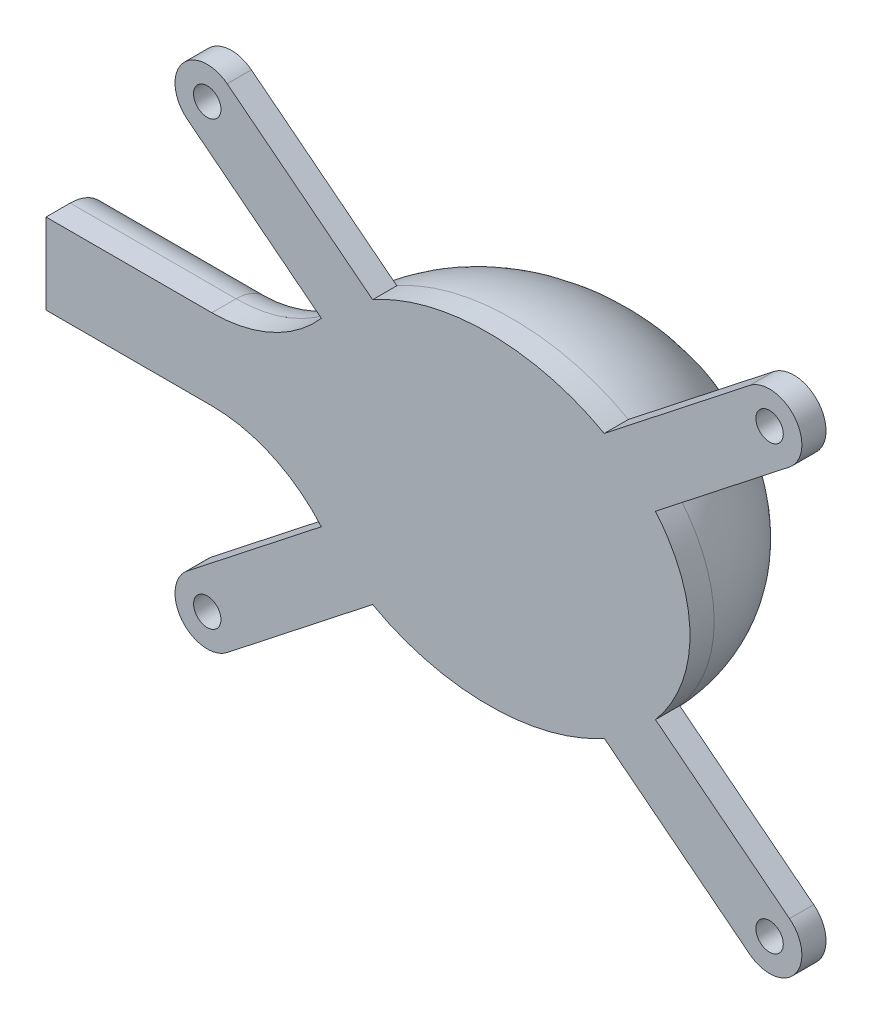
ISO-10303-21;
HEADER;
FILE_DESCRIPTION(('STEP AP214'),'2;1');
FILE_NAME('part.step','',(''),(''),'','','');
FILE_SCHEMA(('AUTOMOTIVE_DESIGN { 1 0 10303 214 1 1 1 1 }'));
ENDSEC;
DATA;
#1=APPLICATION_CONTEXT('core data for automotive mechanical design processes');
#2=APPLICATION_PROTOCOL_DEFINITION('international standard','automotive_design',2000,#1);
#3=PRODUCT_CONTEXT('',#1,'mechanical');
#4=PRODUCT('Part','Part','',(#3));
#5=PRODUCT_RELATED_PRODUCT_CATEGORY('part','',(#4));
#6=PRODUCT_DEFINITION_FORMATION('','',#4);
#7=PRODUCT_DEFINITION_CONTEXT('part definition',#1,'design');
#8=PRODUCT_DEFINITION('design','',#6,#7);
#9=PRODUCT_DEFINITION_SHAPE('','',#8);
#10=(LENGTH_UNIT() NAMED_UNIT(*) SI_UNIT(.MILLI.,.METRE.));
#11=(NAMED_UNIT(*) PLANE_ANGLE_UNIT() SI_UNIT($,.RADIAN.));
#12=(NAMED_UNIT(*) SI_UNIT($,.STERADIAN.) SOLID_ANGLE_UNIT());
#13=UNCERTAINTY_MEASURE_WITH_UNIT(LENGTH_MEASURE(1.E-05),#10,'distance_accuracy_value','');
#14=(GEOMETRIC_REPRESENTATION_CONTEXT(3) GLOBAL_UNCERTAINTY_ASSIGNED_CONTEXT((#13)) GLOBAL_UNIT_ASSIGNED_CONTEXT((#10,
#11,#12)) REPRESENTATION_CONTEXT('',''));
#15=CARTESIAN_POINT('',(0.,0.,0.));
#16=DIRECTION('',(0.,0.,1.));
#17=DIRECTION('',(1.,0.,0.));
#18=AXIS2_PLACEMENT_3D('',#15,#16,#17);
#19=CARTESIAN_POINT('',(0.,0.,0.));
#20=DIRECTION('',(0.,0.,-1.));
#21=DIRECTION('',(1.,0.,0.));
#22=AXIS2_PLACEMENT_3D('',#19,#20,#21);
#23=PLANE('',#22);
#24=DIRECTION('',(0.786318338822422,0.617821551931904,0.));
#25=VECTOR('',#24,1.);
#26=CARTESIAN_POINT('',(-37.3413406568325,-24.2526265690071,0.));
#27=LINE('',#26,#25);
#28=CARTESIAN_POINT('',(-20.7197162752524,-11.1927788406226,0.));
#29=VERTEX_POINT('',#28);
#30=CARTESIAN_POINT('',(-20.7189330004743,-11.1921634104398,0.));
#31=VERTEX_POINT('',#30);
#32=EDGE_CURVE('E529',#29,#31,#27,.T.);
#33=ORIENTED_EDGE('',*,*,#32,.T.);
#34=CARTESIAN_POINT('',(-34.3047710340387,-23.,1.60678761962352E-13));
#35=DIRECTION('',(0.,0.,-1.));
#36=DIRECTION('',(0.,1.,0.));
#37=AXIS2_PLACEMENT_3D('',#34,#35,#36);
#38=CIRCLE('',#37,18.);
#39=CARTESIAN_POINT('',(-34.3047710340404,-5.00000002413178,0.));
#40=VERTEX_POINT('',#39);
#41=EDGE_CURVE('E633',#31,#40,#38,.F.);
#42=ORIENTED_EDGE('',*,*,#41,.T.);
#43=CARTESIAN_POINT('',(-34.3060891721499,-23.,1.60608141586784E-13));
#44=DIRECTION('',(0.,0.,-1.));
#45=DIRECTION('',(0.,1.,0.));
#46=AXIS2_PLACEMENT_3D('',#43,#44,#45);
#47=CIRCLE('',#46,18.);
#48=EDGE_CURVE('E635',#40,#29,#47,.T.);
#49=ORIENTED_EDGE('',*,*,#48,.T.);
#50=EDGE_LOOP('',(#33,#42,#49));
#51=FACE_BOUND('',#50,.T.);
#52=ADVANCED_FACE('F195',(#51),#23,.F.);
#53=CARTESIAN_POINT('',(-34.3060891721499,23.,-1.60608141586784E-13));
#54=DIRECTION('',(0.,0.,-1.));
#55=DIRECTION('',(0.,1.,0.));
#56=AXIS2_PLACEMENT_3D('',#53,#54,#55);
#57=CIRCLE('',#56,18.);
#58=CARTESIAN_POINT('',(-20.7197162752524,11.1927788406226,0.));
#59=VERTEX_POINT('',#58);
#60=CARTESIAN_POINT('',(-34.3047710340404,5.00000002413178,0.));
#61=VERTEX_POINT('',#60);
#62=EDGE_CURVE('E660',#59,#61,#57,.T.);
#63=ORIENTED_EDGE('',*,*,#62,.T.);
#64=CARTESIAN_POINT('',(-34.3047710340387,23.,-1.60678761962352E-13));
#65=DIRECTION('',(0.,0.,-1.));
#66=DIRECTION('',(0.,1.,0.));
#67=AXIS2_PLACEMENT_3D('',#64,#65,#66);
#68=CIRCLE('',#67,18.);
#69=CARTESIAN_POINT('',(-20.7189330004743,11.1921634104399,0.));
#70=VERTEX_POINT('',#69);
#71=EDGE_CURVE('E204',#61,#70,#68,.F.);
#72=ORIENTED_EDGE('',*,*,#71,.T.);
#73=DIRECTION('',(0.786318338822422,-0.617821551931904,0.));
#74=VECTOR('',#73,1.);
#75=CARTESIAN_POINT('',(-37.3413406568325,24.2526265690071,0.));
#76=LINE('',#75,#74);
#77=EDGE_CURVE('E534',#59,#70,#76,.T.);
#78=ORIENTED_EDGE('',*,*,#77,.F.);
#79=EDGE_LOOP('',(#63,#72,#78));
#80=FACE_BOUND('',#79,.T.);
#81=ADVANCED_FACE('F624',(#80),#23,.F.);
#82=CARTESIAN_POINT('',(-32.3987682413773,30.5431732795864,3.));
#83=DIRECTION('',(0.617821551931904,0.786318338822422,0.));
#84=DIRECTION('',(-0.786318338822422,0.617821551931904,0.));
#85=AXIS2_PLACEMENT_3D('',#82,#83,#84);
#86=PLANE('',#85);
#87=DIRECTION('',(0.786318338822422,-0.617821551931904,0.));
#88=VECTOR('',#87,1.);
#89=CARTESIAN_POINT('',(-32.3987682413773,30.5431732795864,3.));
#90=LINE('',#89,#88);
#91=CARTESIAN_POINT('',(-32.3987682413773,30.5431732795864,3.));
#92=VERTEX_POINT('',#91);
#93=CARTESIAN_POINT('',(-14.3612173061904,16.370811830511,3.));
#94=VERTEX_POINT('',#93);
#95=EDGE_CURVE('E457',#92,#94,#90,.T.);
#96=ORIENTED_EDGE('',*,*,#95,.T.);
#97=DIRECTION('',(0.,0.,-1.));
#98=VECTOR('',#97,1.);
#99=CARTESIAN_POINT('',(-14.3612173061904,16.3708118305111,3.));
#100=LINE('',#99,#98);
#101=CARTESIAN_POINT('',(-14.3612173061904,16.3708118305111,-1.14316768015883E-13));
#102=VERTEX_POINT('',#101);
#103=EDGE_CURVE('E421',#94,#102,#100,.T.);
#104=ORIENTED_EDGE('',*,*,#103,.T.);
#105=DIRECTION('',(0.786318338822422,-0.617821551931904,0.));
#106=VECTOR('',#105,1.);
#107=CARTESIAN_POINT('',(-32.3987682413773,30.5431732795864,0.));
#108=LINE('',#107,#106);
#109=CARTESIAN_POINT('',(-32.3987682413773,30.5431732795864,0.));
#110=VERTEX_POINT('',#109);
#111=EDGE_CURVE('E453',#110,#102,#108,.T.);
#112=ORIENTED_EDGE('',*,*,#111,.F.);
#113=DIRECTION('',(0.,0.,-1.));
#114=VECTOR('',#113,1.);
#115=CARTESIAN_POINT('',(-32.3987682413773,30.5431732795864,3.));
#116=LINE('',#115,#114);
#117=EDGE_CURVE('E541',#92,#110,#116,.T.);
#118=ORIENTED_EDGE('',*,*,#117,.F.);
#119=EDGE_LOOP('',(#96,#104,#112,#118));
#120=FACE_BOUND('',#119,.T.);
#121=ADVANCED_FACE('F629',(#120),#86,.T.);
#122=CARTESIAN_POINT('',(-37.3413406568325,24.2526265690071,3.));
#123=DIRECTION('',(0.617821551931904,0.786318338822422,0.));
#124=DIRECTION('',(-0.786318338822422,0.617821551931904,0.));
#125=AXIS2_PLACEMENT_3D('',#122,#123,#124);
#126=PLANE('',#125);
#127=DIRECTION('',(0.,0.,-1.));
#128=VECTOR('',#127,1.);
#129=CARTESIAN_POINT('',(-20.7189330004743,11.1921634104399,3.));
#130=LINE('',#129,#128);
#131=CARTESIAN_POINT('',(-20.7189330004743,11.1921634104399,3.));
#132=VERTEX_POINT('',#131);
#133=EDGE_CURVE('E418',#132,#70,#130,.T.);
#134=ORIENTED_EDGE('',*,*,#133,.F.);
#135=DIRECTION('',(0.786318338822422,-0.617821551931904,0.));
#136=VECTOR('',#135,1.);
#137=CARTESIAN_POINT('',(-37.3413406568325,24.2526265690071,3.));
#138=LINE('',#137,#136);
#139=CARTESIAN_POINT('',(-37.3413406568325,24.2526265690071,3.));
#140=VERTEX_POINT('',#139);
#141=EDGE_CURVE('E492',#140,#132,#138,.T.);
#142=ORIENTED_EDGE('',*,*,#141,.F.);
#143=DIRECTION('',(0.,0.,-1.));
#144=VECTOR('',#143,1.);
#145=CARTESIAN_POINT('',(-37.3413406568325,24.2526265690071,3.));
#146=LINE('',#145,#144);
#147=CARTESIAN_POINT('',(-37.3413406568325,24.2526265690071,0.));
#148=VERTEX_POINT('',#147);
#149=EDGE_CURVE('E545',#140,#148,#146,.T.);
#150=ORIENTED_EDGE('',*,*,#149,.T.);
#151=EDGE_CURVE('E535',#148,#59,#76,.T.);
#152=ORIENTED_EDGE('',*,*,#151,.T.);
#153=ORIENTED_EDGE('',*,*,#77,.T.);
#154=EDGE_LOOP('',(#134,#142,#150,#152,#153));
#155=FACE_BOUND('',#154,.T.);
#156=ADVANCED_FACE('F756',(#155),#126,.F.);
#157=CARTESIAN_POINT('',(6.47436138718722,0.,3.));
#158=DIRECTION('',(-0.617821551931904,0.786318338822422,0.));
#159=DIRECTION('',(-0.786318338822422,-0.617821551931904,0.));
#160=AXIS2_PLACEMENT_3D('',#157,#158,#159);
#161=PLANE('',#160);
#162=DIRECTION('',(0.,0.,-1.));
#163=VECTOR('',#162,1.);
#164=CARTESIAN_POINT('',(20.7189330004743,11.1921634104399,3.));
#165=LINE('',#164,#163);
#166=CARTESIAN_POINT('',(20.7189330004743,11.1921634104399,0.));
#167=VERTEX_POINT('',#166);
#168=CARTESIAN_POINT('',(20.7189330004743,11.1921634104399,3.));
#169=VERTEX_POINT('',#168);
#170=EDGE_CURVE('E411',#167,#169,#165,.F.);
#171=ORIENTED_EDGE('',*,*,#170,.F.);
#172=DIRECTION('',(0.786318338822422,0.617821551931904,0.));
#173=VECTOR('',#172,1.);
#174=CARTESIAN_POINT('',(6.47436138718722,0.,0.));
#175=LINE('',#174,#173);
#176=CARTESIAN_POINT('',(37.3413406568325,24.2526265690071,0.));
#177=VERTEX_POINT('',#176);
#178=EDGE_CURVE('E509',#167,#177,#175,.T.);
#179=ORIENTED_EDGE('',*,*,#178,.T.);
#180=DIRECTION('',(0.,0.,-1.));
#181=VECTOR('',#180,1.);
#182=CARTESIAN_POINT('',(37.3413406568325,24.2526265690071,3.));
#183=LINE('',#182,#181);
#184=CARTESIAN_POINT('',(37.3413406568325,24.2526265690071,3.));
#185=VERTEX_POINT('',#184);
#186=EDGE_CURVE('E564',#185,#177,#183,.T.);
#187=ORIENTED_EDGE('',*,*,#186,.F.);
#188=DIRECTION('',(0.786318338822422,0.617821551931904,0.));
#189=VECTOR('',#188,1.);
#190=CARTESIAN_POINT('',(6.47436138718722,0.,3.));
#191=LINE('',#190,#189);
#192=EDGE_CURVE('E468',#169,#185,#191,.T.);
#193=ORIENTED_EDGE('',*,*,#192,.F.);
#194=EDGE_LOOP('',(#171,#179,#187,#193));
#195=FACE_BOUND('',#194,.T.);
#196=ADVANCED_FACE('F815',(#195),#161,.F.);
#197=CARTESIAN_POINT('',(0.,5.08699823278997,3.));
#198=DIRECTION('',(-0.617821551931904,0.786318338822422,0.));
#199=DIRECTION('',(-0.786318338822422,-0.617821551931904,0.));
#200=AXIS2_PLACEMENT_3D('',#197,#198,#199);
#201=PLANE('',#200);
#202=DIRECTION('',(0.786318338822422,0.617821551931904,0.));
#203=VECTOR('',#202,1.);
#204=CARTESIAN_POINT('',(0.,5.08699823278997,0.));
#205=LINE('',#204,#203);
#206=CARTESIAN_POINT('',(14.3612173061905,16.3708118305111,-1.14316768015884E-13));
#207=VERTEX_POINT('',#206);
#208=CARTESIAN_POINT('',(32.3987682413773,30.5431732795864,0.));
#209=VERTEX_POINT('',#208);
#210=EDGE_CURVE('E502',#207,#209,#205,.T.);
#211=ORIENTED_EDGE('',*,*,#210,.F.);
#212=DIRECTION('',(0.,0.,-1.));
#213=VECTOR('',#212,1.);
#214=CARTESIAN_POINT('',(14.3612173061905,16.3708118305111,3.));
#215=LINE('',#214,#213);
#216=CARTESIAN_POINT('',(14.3612173061905,16.3708118305111,3.));
#217=VERTEX_POINT('',#216);
#218=EDGE_CURVE('E648',#207,#217,#215,.F.);
#219=ORIENTED_EDGE('',*,*,#218,.T.);
#220=DIRECTION('',(0.786318338822422,0.617821551931904,0.));
#221=VECTOR('',#220,1.);
#222=CARTESIAN_POINT('',(0.,5.08699823278997,3.));
#223=LINE('',#222,#221);
#224=CARTESIAN_POINT('',(32.3987682413773,30.5431732795864,3.));
#225=VERTEX_POINT('',#224);
#226=EDGE_CURVE('E460',#217,#225,#223,.T.);
#227=ORIENTED_EDGE('',*,*,#226,.T.);
#228=DIRECTION('',(0.,0.,-1.));
#229=VECTOR('',#228,1.);
#230=CARTESIAN_POINT('',(32.3987682413773,30.5431732795864,3.));
#231=LINE('',#230,#229);
#232=EDGE_CURVE('E498',#225,#209,#231,.T.);
#233=ORIENTED_EDGE('',*,*,#232,.T.);
#234=EDGE_LOOP('',(#211,#219,#227,#233));
#235=FACE_BOUND('',#234,.T.);
#236=ADVANCED_FACE('F605',(#235),#201,.T.);
#237=CARTESIAN_POINT('',(0.,0.,0.));
#238=DIRECTION('',(0.,0.,-1.));
#239=DIRECTION('',(1.,0.,0.));
#240=AXIS2_PLACEMENT_3D('',#237,#238,#239);
#241=ELLIPSE('',#240,25.,20.);
#242=TRIMMED_CURVE('',#241,(PARAMETER_VALUE(6.28318530717959)),
(PARAMETER_VALUE(9.42477796076938)),.T.,.PARAMETER.);
#243=CARTESIAN_POINT('',(25.,0.,0.));
#244=DIRECTION('',(1.,0.,0.));
#245=AXIS1_PLACEMENT('',#243,#244);
#246=SURFACE_OF_REVOLUTION('',#242,#245);
#247=CARTESIAN_POINT('',(25.,0.,0.));
#248=VERTEX_POINT('',#247);
#249=CARTESIAN_POINT('',(20.7189330004743,-11.1921634104398,0.));
#250=VERTEX_POINT('',#249);
#251=EDGE_CURVE('E593',#248,#250,#241,.T.);
#252=ORIENTED_EDGE('',*,*,#251,.T.);
#253=CARTESIAN_POINT('',(0.,0.,0.));
#254=DIRECTION('',(0.,0.,-1.));
#255=DIRECTION('',(1.,0.,0.));
#256=AXIS2_PLACEMENT_3D('',#253,#254,#255);
#257=ELLIPSE('',#256,25.,20.);
#258=CARTESIAN_POINT('',(14.3612173061905,-16.370811830511,0.));
#259=VERTEX_POINT('',#258);
#260=EDGE_CURVE('E575',#250,#259,#257,.T.);
#261=ORIENTED_EDGE('',*,*,#260,.T.);
#262=CARTESIAN_POINT('',(-14.3612173061904,-16.370811830511,0.));
#263=VERTEX_POINT('',#262);
#264=EDGE_CURVE('E592',#259,#263,#241,.T.);
#265=ORIENTED_EDGE('',*,*,#264,.T.);
#266=CARTESIAN_POINT('',(-20.6295359356946,-11.2973553599879,0.));
#267=VERTEX_POINT('',#266);
#268=EDGE_CURVE('E544',#263,#267,#257,.T.);
#269=ORIENTED_EDGE('',*,*,#268,.T.);
#270=CARTESIAN_POINT('',(-20.6295359356946,0.,0.));
#271=DIRECTION('',(1.,0.,0.));
#272=DIRECTION('',(0.,0.,-1.));
#273=AXIS2_PLACEMENT_3D('',#270,#271,#272);
#274=CIRCLE('',#273,11.2973553599879);
#275=CARTESIAN_POINT('',(-20.6295359356946,11.2973553599879,0.));
#276=VERTEX_POINT('',#275);
#277=EDGE_CURVE('E680',#267,#276,#274,.T.);
#278=ORIENTED_EDGE('',*,*,#277,.T.);
#279=CARTESIAN_POINT('',(0.,0.,0.));
#280=DIRECTION('',(0.,0.,1.));
#281=DIRECTION('',(1.,0.,0.));
#282=AXIS2_PLACEMENT_3D('',#279,#280,#281);
#283=ELLIPSE('',#282,25.,20.);
#284=EDGE_CURVE('E574',#276,#102,#283,.F.);
#285=ORIENTED_EDGE('',*,*,#284,.T.);
#286=CARTESIAN_POINT('',(0.,0.,0.));
#287=DIRECTION('',(0.,0.,1.));
#288=DIRECTION('',(1.,0.,0.));
#289=AXIS2_PLACEMENT_3D('',#286,#287,#288);
#290=ELLIPSE('',#289,25.,20.);
#291=EDGE_CURVE('E588',#207,#102,#290,.T.);
#292=ORIENTED_EDGE('',*,*,#291,.F.);
#293=EDGE_CURVE('E579',#207,#167,#283,.F.);
#294=ORIENTED_EDGE('',*,*,#293,.T.);
#295=EDGE_CURVE('E589',#248,#167,#290,.T.);
#296=ORIENTED_EDGE('',*,*,#295,.F.);
#297=EDGE_LOOP('',(#252,#261,#265,#269,#278,#285,#292,#294,#296));
#298=FACE_BOUND('',#297,.T.);
#299=ADVANCED_FACE('F601',(#298),#246,.F.);
#300=CARTESIAN_POINT('',(-54.865727699422,0.,0.));
#301=DIRECTION('',(-1.,0.,0.));
#302=DIRECTION('',(0.,0.,1.));
#303=AXIS2_PLACEMENT_3D('',#300,#301,#302);
#304=PLANE('',#303);
#305=CARTESIAN_POINT('',(-54.865727699422,0.,0.));
#306=DIRECTION('',(1.,0.,0.));
#307=DIRECTION('',(0.,0.,-1.));
#308=AXIS2_PLACEMENT_3D('',#305,#306,#307);
#309=CIRCLE('',#308,5.);
#310=CARTESIAN_POINT('',(-54.865727699422,-5.,0.));
#311=VERTEX_POINT('',#310);
#312=CARTESIAN_POINT('',(-54.865727699422,5.,0.));
#313=VERTEX_POINT('',#312);
#314=EDGE_CURVE('E377',#311,#313,#309,.T.);
#315=ORIENTED_EDGE('',*,*,#314,.F.);
#316=DIRECTION('',(0.,0.,-1.));
#317=VECTOR('',#316,1.);
#318=CARTESIAN_POINT('',(-54.865727699422,-5.,3.));
#319=LINE('',#318,#317);
#320=CARTESIAN_POINT('',(-54.865727699422,-5.,3.));
#321=VERTEX_POINT('',#320);
#322=EDGE_CURVE('E358',#321,#311,#319,.T.);
#323=ORIENTED_EDGE('',*,*,#322,.F.);
#324=DIRECTION('',(0.,-1.,0.));
#325=VECTOR('',#324,1.);
#326=CARTESIAN_POINT('',(-54.865727699422,-5.,3.));
#327=LINE('',#326,#325);
#328=CARTESIAN_POINT('',(-54.865727699422,5.,3.));
#329=VERTEX_POINT('',#328);
#330=EDGE_CURVE('E364',#329,#321,#327,.T.);
#331=ORIENTED_EDGE('',*,*,#330,.F.);
#332=DIRECTION('',(0.,0.,-1.));
#333=VECTOR('',#332,1.);
#334=CARTESIAN_POINT('',(-54.865727699422,5.,3.));
#335=LINE('',#334,#333);
#336=EDGE_CURVE('E380',#329,#313,#335,.T.);
#337=ORIENTED_EDGE('',*,*,#336,.T.);
#338=EDGE_LOOP('',(#315,#323,#331,#337));
#339=FACE_BOUND('',#338,.T.);
#340=ADVANCED_FACE('F375',(#339),#304,.T.);
#341=CARTESIAN_POINT('',(-14.6473229179582,0.,0.));
#342=DIRECTION('',(1.,0.,0.));
#343=DIRECTION('',(0.,0.,-1.));
#344=AXIS2_PLACEMENT_3D('',#341,#342,#343);
#345=CYLINDRICAL_SURFACE('',#344,5.);
#346=DIRECTION('',(-1.,0.,0.));
#347=VECTOR('',#346,1.);
#348=CARTESIAN_POINT('',(-14.6473229179582,5.,0.));
#349=LINE('',#348,#347);
#350=CARTESIAN_POINT('',(-34.3060891721499,5.,0.));
#351=VERTEX_POINT('',#350);
#352=EDGE_CURVE('E580',#351,#313,#349,.T.);
#353=ORIENTED_EDGE('',*,*,#352,.F.);
#354=CARTESIAN_POINT('',(-34.3060891721499,0.,0.));
#355=DIRECTION('',(-1.,0.,0.));
#356=DIRECTION('',(0.,0.,1.));
#357=AXIS2_PLACEMENT_3D('',#354,#355,#356);
#358=CIRCLE('',#357,5.);
#359=CARTESIAN_POINT('',(-34.3060891721499,-5.,0.));
#360=VERTEX_POINT('',#359);
#361=EDGE_CURVE('E598',#351,#360,#358,.T.);
#362=ORIENTED_EDGE('',*,*,#361,.T.);
#363=DIRECTION('',(-1.,0.,0.));
#364=VECTOR('',#363,1.);
#365=CARTESIAN_POINT('',(-14.6473229179582,-5.,0.));
#366=LINE('',#365,#364);
#367=EDGE_CURVE('E583',#360,#311,#366,.T.);
#368=ORIENTED_EDGE('',*,*,#367,.T.);
#369=ORIENTED_EDGE('',*,*,#314,.T.);
#370=EDGE_LOOP('',(#353,#362,#368,#369));
#371=FACE_BOUND('',#370,.T.);
#372=ADVANCED_FACE('F611',(#371),#345,.T.);
#373=CARTESIAN_POINT('',(-34.3060891721499,0.,0.));
#374=DIRECTION('',(-1.,0.,0.));
#375=DIRECTION('',(0.,0.,1.));
#376=AXIS2_PLACEMENT_3D('',#373,#374,#375);
#377=TOROIDAL_SURFACE('',#376,23.,18.);
#378=EDGE_CURVE('E663',#276,#59,#57,.T.);
#379=ORIENTED_EDGE('',*,*,#378,.F.);
#380=ORIENTED_EDGE('',*,*,#277,.F.);
#381=EDGE_CURVE('E668',#29,#267,#47,.T.);
#382=ORIENTED_EDGE('',*,*,#381,.F.);
#383=ORIENTED_EDGE('',*,*,#48,.F.);
#384=EDGE_CURVE('E661',#360,#40,#47,.T.);
#385=ORIENTED_EDGE('',*,*,#384,.F.);
#386=ORIENTED_EDGE('',*,*,#361,.F.);
#387=EDGE_CURVE('E656',#61,#351,#57,.T.);
#388=ORIENTED_EDGE('',*,*,#387,.F.);
#389=ORIENTED_EDGE('',*,*,#62,.F.);
#390=EDGE_LOOP('',(#379,#380,#382,#383,#385,#386,#388,#389));
#391=FACE_BOUND('',#390,.T.);
#392=ADVANCED_FACE('F608',(#391),#377,.F.);
#393=CARTESIAN_POINT('',(34.8700544491049,27.3978999242967,0.));
#394=DIRECTION('',(0.,0.,1.));
#395=DIRECTION('',(1.,0.,0.));
#396=AXIS2_PLACEMENT_3D('',#393,#394,#395);
#397=PLANE('',#396);
#398=ORIENTED_EDGE('',*,*,#260,.F.);
#399=DIRECTION('',(0.786318338822422,-0.617821551931904,0.));
#400=VECTOR('',#399,1.);
#401=CARTESIAN_POINT('',(6.47436138718722,0.,0.));
#402=LINE('',#401,#400);
#403=CARTESIAN_POINT('',(37.3413406568325,-24.2526265690071,0.));
#404=VERTEX_POINT('',#403);
#405=EDGE_CURVE('E512',#250,#404,#402,.T.);
#406=ORIENTED_EDGE('',*,*,#405,.T.);
#407=CARTESIAN_POINT('',(34.8700544491049,-27.3978999242967,0.));
#408=DIRECTION('',(0.,0.,1.));
#409=DIRECTION('',(1.,0.,0.));
#410=AXIS2_PLACEMENT_3D('',#407,#408,#409);
#411=CIRCLE('',#410,3.99999999999999);
#412=CARTESIAN_POINT('',(32.3987682413773,-30.5431732795864,0.));
#413=VERTEX_POINT('',#412);
#414=EDGE_CURVE('E515',#413,#404,#411,.T.);
#415=ORIENTED_EDGE('',*,*,#414,.F.);
#416=DIRECTION('',(0.786318338822422,-0.617821551931904,0.));
#417=VECTOR('',#416,1.);
#418=CARTESIAN_POINT('',(0.,-5.08699823278995,0.));
#419=LINE('',#418,#417);
#420=EDGE_CURVE('E519',#259,#413,#419,.T.);
#421=ORIENTED_EDGE('',*,*,#420,.F.);
#422=EDGE_LOOP('',(#398,#406,#415,#421));
#423=FACE_BOUND('',#422,.T.);
#424=CARTESIAN_POINT('',(34.8700544491049,-27.3978999242967,0.));
#425=DIRECTION('',(0.,0.,1.));
#426=DIRECTION('',(1.,0.,0.));
#427=AXIS2_PLACEMENT_3D('',#424,#425,#426);
#428=CIRCLE('',#427,1.7);
#429=CARTESIAN_POINT('',(36.5700544491049,-27.3978999242967,0.));
#430=VERTEX_POINT('',#429);
#431=EDGE_CURVE('E424',#430,#430,#428,.T.);
#432=ORIENTED_EDGE('',*,*,#431,.T.);
#433=EDGE_LOOP('',(#432));
#434=FACE_BOUND('',#433,.T.);
#435=ADVANCED_FACE('F610',(#423,#434),#397,.F.);
#436=ORIENTED_EDGE('',*,*,#293,.F.);
#437=ORIENTED_EDGE('',*,*,#210,.T.);
#438=CARTESIAN_POINT('',(34.8700544491049,27.3978999242967,0.));
#439=DIRECTION('',(0.,0.,1.));
#440=DIRECTION('',(1.,0.,0.));
#441=AXIS2_PLACEMENT_3D('',#438,#439,#440);
#442=CIRCLE('',#441,4.);
#443=EDGE_CURVE('E505',#177,#209,#442,.T.);
#444=ORIENTED_EDGE('',*,*,#443,.F.);
#445=ORIENTED_EDGE('',*,*,#178,.F.);
#446=EDGE_LOOP('',(#436,#437,#444,#445));
#447=FACE_BOUND('',#446,.T.);
#448=CARTESIAN_POINT('',(34.8700544491049,27.3978999242967,0.));
#449=DIRECTION('',(0.,0.,1.));
#450=DIRECTION('',(1.,0.,0.));
#451=AXIS2_PLACEMENT_3D('',#448,#449,#450);
#452=CIRCLE('',#451,1.7);
#453=CARTESIAN_POINT('',(36.5700544491049,27.3978999242967,0.));
#454=VERTEX_POINT('',#453);
#455=EDGE_CURVE('E445',#454,#454,#452,.T.);
#456=ORIENTED_EDGE('',*,*,#455,.T.);
#457=EDGE_LOOP('',(#456));
#458=FACE_BOUND('',#457,.T.);
#459=ADVANCED_FACE('F775',(#447,#458),#397,.F.);
#460=ORIENTED_EDGE('',*,*,#284,.F.);
#461=ORIENTED_EDGE('',*,*,#378,.T.);
#462=ORIENTED_EDGE('',*,*,#151,.F.);
#463=CARTESIAN_POINT('',(-34.8700544491049,27.3978999242967,0.));
#464=DIRECTION('',(0.,0.,1.));
#465=DIRECTION('',(1.,0.,0.));
#466=AXIS2_PLACEMENT_3D('',#463,#464,#465);
#467=CIRCLE('',#466,4.);
#468=EDGE_CURVE('E461',#110,#148,#467,.T.);
#469=ORIENTED_EDGE('',*,*,#468,.F.);
#470=ORIENTED_EDGE('',*,*,#111,.T.);
#471=EDGE_LOOP('',(#460,#461,#462,#469,#470));
#472=FACE_BOUND('',#471,.T.);
#473=CARTESIAN_POINT('',(-34.8700544491049,27.3978999242967,0.));
#474=DIRECTION('',(0.,0.,1.));
#475=DIRECTION('',(1.,0.,0.));
#476=AXIS2_PLACEMENT_3D('',#473,#474,#475);
#477=CIRCLE('',#476,1.7);
#478=CARTESIAN_POINT('',(-33.1700544491049,27.3978999242967,0.));
#479=VERTEX_POINT('',#478);
#480=EDGE_CURVE('E437',#479,#479,#477,.T.);
#481=ORIENTED_EDGE('',*,*,#480,.T.);
#482=EDGE_LOOP('',(#481));
#483=FACE_BOUND('',#482,.T.);
#484=ADVANCED_FACE('F747',(#472,#483),#397,.F.);
#485=CARTESIAN_POINT('',(34.8700544491049,27.3978999242967,3.));
#486=DIRECTION('',(0.,0.,1.));
#487=DIRECTION('',(1.,0.,0.));
#488=AXIS2_PLACEMENT_3D('',#485,#486,#487);
#489=PLANE('',#488);
#490=DIRECTION('',(1.,0.,0.));
#491=VECTOR('',#490,1.);
#492=CARTESIAN_POINT('',(-54.865727699422,-5.,3.));
#493=LINE('',#492,#491);
#494=CARTESIAN_POINT('',(-34.3047710340387,-5.,3.));
#495=VERTEX_POINT('',#494);
#496=EDGE_CURVE('E353',#321,#495,#493,.T.);
#497=ORIENTED_EDGE('',*,*,#496,.T.);
#498=CARTESIAN_POINT('',(-34.3047710340387,-23.,3.));
#499=DIRECTION('',(0.,0.,1.));
#500=DIRECTION('',(1.,0.,0.));
#501=AXIS2_PLACEMENT_3D('',#498,#499,#500);
#502=CIRCLE('',#501,18.);
#503=CARTESIAN_POINT('',(-20.7189330004743,-11.1921634104398,3.));
#504=VERTEX_POINT('',#503);
#505=EDGE_CURVE('E642',#495,#504,#502,.F.);
#506=ORIENTED_EDGE('',*,*,#505,.T.);
#507=DIRECTION('',(0.786318338822422,0.617821551931904,0.));
#508=VECTOR('',#507,1.);
#509=CARTESIAN_POINT('',(-37.3413406568325,-24.2526265690071,3.));
#510=LINE('',#509,#508);
#511=CARTESIAN_POINT('',(-37.3413406568325,-24.2526265690071,3.));
#512=VERTEX_POINT('',#511);
#513=EDGE_CURVE('E488',#512,#504,#510,.T.);
#514=ORIENTED_EDGE('',*,*,#513,.F.);
#515=CARTESIAN_POINT('',(-34.8700544491049,-27.3978999242967,3.));
#516=DIRECTION('',(0.,0.,1.));
#517=DIRECTION('',(1.,0.,0.));
#518=AXIS2_PLACEMENT_3D('',#515,#516,#517);
#519=CIRCLE('',#518,4.);
#520=CARTESIAN_POINT('',(-32.3987682413773,-30.5431732795864,3.));
#521=VERTEX_POINT('',#520);
#522=EDGE_CURVE('E485',#512,#521,#519,.T.);
#523=ORIENTED_EDGE('',*,*,#522,.T.);
#524=DIRECTION('',(0.786318338822422,0.617821551931904,0.));
#525=VECTOR('',#524,1.);
#526=CARTESIAN_POINT('',(-32.3987682413773,-30.5431732795864,3.));
#527=LINE('',#526,#525);
#528=CARTESIAN_POINT('',(-14.3612173061904,-16.370811830511,3.));
#529=VERTEX_POINT('',#528);
#530=EDGE_CURVE('E481',#521,#529,#527,.T.);
#531=ORIENTED_EDGE('',*,*,#530,.T.);
#532=CARTESIAN_POINT('',(0.,0.,3.));
#533=DIRECTION('',(0.,0.,1.));
#534=DIRECTION('',(1.,0.,0.));
#535=AXIS2_PLACEMENT_3D('',#532,#533,#534);
#536=ELLIPSE('',#535,25.,20.);
#537=CARTESIAN_POINT('',(14.3612173061905,-16.370811830511,3.));
#538=VERTEX_POINT('',#537);
#539=EDGE_CURVE('E379',#529,#538,#536,.T.);
#540=ORIENTED_EDGE('',*,*,#539,.T.);
#541=DIRECTION('',(0.786318338822422,-0.617821551931904,0.));
#542=VECTOR('',#541,1.);
#543=CARTESIAN_POINT('',(0.,-5.08699823278995,3.));
#544=LINE('',#543,#542);
#545=CARTESIAN_POINT('',(32.3987682413773,-30.5431732795864,3.));
#546=VERTEX_POINT('',#545);
#547=EDGE_CURVE('E478',#538,#546,#544,.T.);
#548=ORIENTED_EDGE('',*,*,#547,.T.);
#549=CARTESIAN_POINT('',(34.8700544491049,-27.3978999242967,3.));
#550=DIRECTION('',(0.,0.,1.));
#551=DIRECTION('',(1.,0.,0.));
#552=AXIS2_PLACEMENT_3D('',#549,#550,#551);
#553=CIRCLE('',#552,3.99999999999999);
#554=CARTESIAN_POINT('',(37.3413406568325,-24.2526265690071,3.));
#555=VERTEX_POINT('',#554);
#556=EDGE_CURVE('E474',#546,#555,#553,.T.);
#557=ORIENTED_EDGE('',*,*,#556,.T.);
#558=DIRECTION('',(0.786318338822422,-0.617821551931904,0.));
#559=VECTOR('',#558,1.);
#560=CARTESIAN_POINT('',(6.47436138718722,0.,3.));
#561=LINE('',#560,#559);
#562=CARTESIAN_POINT('',(20.7189330004743,-11.1921634104398,3.));
#563=VERTEX_POINT('',#562);
#564=EDGE_CURVE('E471',#563,#555,#561,.T.);
#565=ORIENTED_EDGE('',*,*,#564,.F.);
#566=CARTESIAN_POINT('',(0.,0.,3.));
#567=DIRECTION('',(0.,0.,1.));
#568=DIRECTION('',(1.,0.,0.));
#569=AXIS2_PLACEMENT_3D('',#566,#567,#568);
#570=ELLIPSE('',#569,25.,20.);
#571=EDGE_CURVE('E406',#563,#169,#570,.T.);
#572=ORIENTED_EDGE('',*,*,#571,.T.);
#573=ORIENTED_EDGE('',*,*,#192,.T.);
#574=CARTESIAN_POINT('',(34.8700544491049,27.3978999242967,3.));
#575=DIRECTION('',(0.,0.,1.));
#576=DIRECTION('',(1.,0.,0.));
#577=AXIS2_PLACEMENT_3D('',#574,#575,#576);
#578=CIRCLE('',#577,4.);
#579=EDGE_CURVE('E464',#185,#225,#578,.T.);
#580=ORIENTED_EDGE('',*,*,#579,.T.);
#581=ORIENTED_EDGE('',*,*,#226,.F.);
#582=EDGE_CURVE('E412',#217,#94,#570,.T.);
#583=ORIENTED_EDGE('',*,*,#582,.T.);
#584=ORIENTED_EDGE('',*,*,#95,.F.);
#585=CARTESIAN_POINT('',(-34.8700544491049,27.3978999242967,3.));
#586=DIRECTION('',(0.,0.,1.));
#587=DIRECTION('',(1.,0.,0.));
#588=AXIS2_PLACEMENT_3D('',#585,#586,#587);
#589=CIRCLE('',#588,4.);
#590=EDGE_CURVE('E495',#92,#140,#589,.T.);
#591=ORIENTED_EDGE('',*,*,#590,.T.);
#592=ORIENTED_EDGE('',*,*,#141,.T.);
#593=CARTESIAN_POINT('',(-34.3047710340387,23.,3.));
#594=DIRECTION('',(0.,0.,1.));
#595=DIRECTION('',(1.,0.,0.));
#596=AXIS2_PLACEMENT_3D('',#593,#594,#595);
#597=CIRCLE('',#596,18.);
#598=CARTESIAN_POINT('',(-34.3047710340387,5.,3.));
#599=VERTEX_POINT('',#598);
#600=EDGE_CURVE('E12',#132,#599,#597,.F.);
#601=ORIENTED_EDGE('',*,*,#600,.T.);
#602=DIRECTION('',(-1.,0.,0.));
#603=VECTOR('',#602,1.);
#604=CARTESIAN_POINT('',(-54.865727699422,5.,3.));
#605=LINE('',#604,#603);
#606=EDGE_CURVE('E363',#599,#329,#605,.T.);
#607=ORIENTED_EDGE('',*,*,#606,.T.);
#608=ORIENTED_EDGE('',*,*,#330,.T.);
#609=EDGE_LOOP('',(#497,#506,#514,#523,#531,#540,#548,#557,#565,#572,#573,#580,#581,#583,#584,
#591,#592,#601,#607,#608));
#610=FACE_BOUND('',#609,.T.);
#611=CARTESIAN_POINT('',(34.8700544491049,-27.3978999242967,3.));
#612=DIRECTION('',(0.,0.,1.));
#613=DIRECTION('',(1.,0.,0.));
#614=AXIS2_PLACEMENT_3D('',#611,#612,#613);
#615=CIRCLE('',#614,1.7);
#616=CARTESIAN_POINT('',(36.5700544491049,-27.3978999242967,3.));
#617=VERTEX_POINT('',#616);
#618=EDGE_CURVE('E425',#617,#617,#615,.T.);
#619=ORIENTED_EDGE('',*,*,#618,.F.);
#620=EDGE_LOOP('',(#619));
#621=FACE_BOUND('',#620,.T.);
#622=CARTESIAN_POINT('',(-34.8700544491049,-27.3978999242967,3.));
#623=DIRECTION('',(0.,0.,1.));
#624=DIRECTION('',(1.,0.,0.));
#625=AXIS2_PLACEMENT_3D('',#622,#623,#624);
#626=CIRCLE('',#625,1.7);
#627=CARTESIAN_POINT('',(-33.1700544491049,-27.3978999242967,3.));
#628=VERTEX_POINT('',#627);
#629=EDGE_CURVE('E433',#628,#628,#626,.T.);
#630=ORIENTED_EDGE('',*,*,#629,.F.);
#631=EDGE_LOOP('',(#630));
#632=FACE_BOUND('',#631,.T.);
#633=CARTESIAN_POINT('',(-34.8700544491049,27.3978999242967,3.));
#634=DIRECTION('',(0.,0.,1.));
#635=DIRECTION('',(1.,0.,0.));
#636=AXIS2_PLACEMENT_3D('',#633,#634,#635);
#637=CIRCLE('',#636,1.7);
#638=CARTESIAN_POINT('',(-33.1700544491049,27.3978999242967,3.));
#639=VERTEX_POINT('',#638);
#640=EDGE_CURVE('E441',#639,#639,#637,.T.);
#641=ORIENTED_EDGE('',*,*,#640,.F.);
#642=EDGE_LOOP('',(#641));
#643=FACE_BOUND('',#642,.T.);
#644=CARTESIAN_POINT('',(34.8700544491049,27.3978999242967,3.));
#645=DIRECTION('',(0.,0.,1.));
#646=DIRECTION('',(1.,0.,0.));
#647=AXIS2_PLACEMENT_3D('',#644,#645,#646);
#648=CIRCLE('',#647,1.7);
#649=CARTESIAN_POINT('',(36.5700544491049,27.3978999242967,3.));
#650=VERTEX_POINT('',#649);
#651=EDGE_CURVE('E449',#650,#650,#648,.T.);
#652=ORIENTED_EDGE('',*,*,#651,.F.);
#653=EDGE_LOOP('',(#652));
#654=FACE_BOUND('',#653,.T.);
#655=ADVANCED_FACE('F367',(#610,#621,#632,#643,#654),#489,.T.);
#656=ORIENTED_EDGE('',*,*,#268,.F.);
#657=DIRECTION('',(0.786318338822422,0.617821551931904,0.));
#658=VECTOR('',#657,1.);
#659=CARTESIAN_POINT('',(-32.3987682413773,-30.5431732795864,0.));
#660=LINE('',#659,#658);
#661=CARTESIAN_POINT('',(-32.3987682413773,-30.5431732795864,0.));
#662=VERTEX_POINT('',#661);
#663=EDGE_CURVE('E522',#662,#263,#660,.T.);
#664=ORIENTED_EDGE('',*,*,#663,.F.);
#665=CARTESIAN_POINT('',(-34.8700544491049,-27.3978999242967,0.));
#666=DIRECTION('',(0.,0.,1.));
#667=DIRECTION('',(1.,0.,0.));
#668=AXIS2_PLACEMENT_3D('',#665,#666,#667);
#669=CIRCLE('',#668,4.);
#670=CARTESIAN_POINT('',(-37.3413406568325,-24.2526265690071,0.));
#671=VERTEX_POINT('',#670);
#672=EDGE_CURVE('E526',#671,#662,#669,.T.);
#673=ORIENTED_EDGE('',*,*,#672,.F.);
#674=EDGE_CURVE('E530',#671,#29,#27,.T.);
#675=ORIENTED_EDGE('',*,*,#674,.T.);
#676=ORIENTED_EDGE('',*,*,#381,.T.);
#677=EDGE_LOOP('',(#656,#664,#673,#675,#676));
#678=FACE_BOUND('',#677,.T.);
#679=CARTESIAN_POINT('',(-34.8700544491049,-27.3978999242967,0.));
#680=DIRECTION('',(0.,0.,1.));
#681=DIRECTION('',(1.,0.,0.));
#682=AXIS2_PLACEMENT_3D('',#679,#680,#681);
#683=CIRCLE('',#682,1.7);
#684=CARTESIAN_POINT('',(-33.1700544491049,-27.3978999242967,0.));
#685=VERTEX_POINT('',#684);
#686=EDGE_CURVE('E429',#685,#685,#683,.T.);
#687=ORIENTED_EDGE('',*,*,#686,.T.);
#688=EDGE_LOOP('',(#687));
#689=FACE_BOUND('',#688,.T.);
#690=ADVANCED_FACE('F696',(#678,#689),#397,.F.);
#691=CARTESIAN_POINT('',(-34.8700544491049,27.3978999242967,3.));
#692=DIRECTION('',(0.,0.,-1.));
#693=DIRECTION('',(-1.,0.,0.));
#694=AXIS2_PLACEMENT_3D('',#691,#692,#693);
#695=CYLINDRICAL_SURFACE('',#694,4.);
#696=ORIENTED_EDGE('',*,*,#468,.T.);
#697=ORIENTED_EDGE('',*,*,#149,.F.);
#698=ORIENTED_EDGE('',*,*,#590,.F.);
#699=ORIENTED_EDGE('',*,*,#117,.T.);
#700=EDGE_LOOP('',(#696,#697,#698,#699));
#701=FACE_BOUND('',#700,.T.);
#702=ADVANCED_FACE('F752',(#701),#695,.T.);
#703=CARTESIAN_POINT('',(-37.3413406568325,-24.2526265690071,3.));
#704=DIRECTION('',(-0.617821551931904,0.786318338822422,0.));
#705=DIRECTION('',(-0.786318338822422,-0.617821551931904,0.));
#706=AXIS2_PLACEMENT_3D('',#703,#704,#705);
#707=PLANE('',#706);
#708=DIRECTION('',(0.,0.,1.));
#709=VECTOR('',#708,1.);
#710=CARTESIAN_POINT('',(-20.7189330004743,-11.1921634104399,0.));
#711=LINE('',#710,#709);
#712=EDGE_CURVE('E413',#31,#504,#711,.T.);
#713=ORIENTED_EDGE('',*,*,#712,.F.);
#714=ORIENTED_EDGE('',*,*,#32,.F.);
#715=ORIENTED_EDGE('',*,*,#674,.F.);
#716=DIRECTION('',(0.,0.,-1.));
#717=VECTOR('',#716,1.);
#718=CARTESIAN_POINT('',(-37.3413406568325,-24.2526265690071,3.));
#719=LINE('',#718,#717);
#720=EDGE_CURVE('E549',#512,#671,#719,.T.);
#721=ORIENTED_EDGE('',*,*,#720,.F.);
#722=ORIENTED_EDGE('',*,*,#513,.T.);
#723=EDGE_LOOP('',(#713,#714,#715,#721,#722));
#724=FACE_BOUND('',#723,.T.);
#725=ADVANCED_FACE('F709',(#724),#707,.T.);
#726=CARTESIAN_POINT('',(-34.8700544491049,-27.3978999242967,3.));
#727=DIRECTION('',(0.,0.,-1.));
#728=DIRECTION('',(-1.,0.,0.));
#729=AXIS2_PLACEMENT_3D('',#726,#727,#728);
#730=CYLINDRICAL_SURFACE('',#729,4.);
#731=ORIENTED_EDGE('',*,*,#672,.T.);
#732=DIRECTION('',(0.,0.,-1.));
#733=VECTOR('',#732,1.);
#734=CARTESIAN_POINT('',(-32.3987682413773,-30.5431732795864,3.));
#735=LINE('',#734,#733);
#736=EDGE_CURVE('E552',#521,#662,#735,.T.);
#737=ORIENTED_EDGE('',*,*,#736,.F.);
#738=ORIENTED_EDGE('',*,*,#522,.F.);
#739=ORIENTED_EDGE('',*,*,#720,.T.);
#740=EDGE_LOOP('',(#731,#737,#738,#739));
#741=FACE_BOUND('',#740,.T.);
#742=ADVANCED_FACE('F707',(#741),#730,.T.);
#743=CARTESIAN_POINT('',(-32.3987682413773,-30.5431732795864,3.));
#744=DIRECTION('',(-0.617821551931904,0.786318338822422,0.));
#745=DIRECTION('',(-0.786318338822423,-0.617821551931904,0.));
#746=AXIS2_PLACEMENT_3D('',#743,#744,#745);
#747=PLANE('',#746);
#748=ORIENTED_EDGE('',*,*,#663,.T.);
#749=DIRECTION('',(0.,0.,1.));
#750=VECTOR('',#749,1.);
#751=CARTESIAN_POINT('',(-14.3612173061905,-16.370811830511,0.));
#752=LINE('',#751,#750);
#753=EDGE_CURVE('E703',#263,#529,#752,.T.);
#754=ORIENTED_EDGE('',*,*,#753,.T.);
#755=ORIENTED_EDGE('',*,*,#530,.F.);
#756=ORIENTED_EDGE('',*,*,#736,.T.);
#757=EDGE_LOOP('',(#748,#754,#755,#756));
#758=FACE_BOUND('',#757,.T.);
#759=ADVANCED_FACE('F701',(#758),#747,.F.);
#760=CARTESIAN_POINT('',(0.,-5.08699823278995,3.));
#761=DIRECTION('',(0.617821551931904,0.786318338822422,0.));
#762=DIRECTION('',(-0.786318338822422,0.617821551931904,0.));
#763=AXIS2_PLACEMENT_3D('',#760,#761,#762);
#764=PLANE('',#763);
#765=ORIENTED_EDGE('',*,*,#547,.F.);
#766=DIRECTION('',(0.,0.,1.));
#767=VECTOR('',#766,1.);
#768=CARTESIAN_POINT('',(14.3612173061905,-16.370811830511,0.));
#769=LINE('',#768,#767);
#770=EDGE_CURVE('E714',#538,#259,#769,.F.);
#771=ORIENTED_EDGE('',*,*,#770,.T.);
#772=ORIENTED_EDGE('',*,*,#420,.T.);
#773=DIRECTION('',(0.,0.,-1.));
#774=VECTOR('',#773,1.);
#775=CARTESIAN_POINT('',(32.3987682413773,-30.5431732795864,3.));
#776=LINE('',#775,#774);
#777=EDGE_CURVE('E556',#546,#413,#776,.T.);
#778=ORIENTED_EDGE('',*,*,#777,.F.);
#779=EDGE_LOOP('',(#765,#771,#772,#778));
#780=FACE_BOUND('',#779,.T.);
#781=ADVANCED_FACE('F718',(#780),#764,.F.);
#782=CARTESIAN_POINT('',(34.8700544491049,-27.3978999242967,3.));
#783=DIRECTION('',(0.,0.,-1.));
#784=DIRECTION('',(-1.,0.,0.));
#785=AXIS2_PLACEMENT_3D('',#782,#783,#784);
#786=CYLINDRICAL_SURFACE('',#785,3.99999999999999);
#787=ORIENTED_EDGE('',*,*,#414,.T.);
#788=DIRECTION('',(0.,0.,-1.));
#789=VECTOR('',#788,1.);
#790=CARTESIAN_POINT('',(37.3413406568325,-24.2526265690071,3.));
#791=LINE('',#790,#789);
#792=EDGE_CURVE('E560',#555,#404,#791,.T.);
#793=ORIENTED_EDGE('',*,*,#792,.F.);
#794=ORIENTED_EDGE('',*,*,#556,.F.);
#795=ORIENTED_EDGE('',*,*,#777,.T.);
#796=EDGE_LOOP('',(#787,#793,#794,#795));
#797=FACE_BOUND('',#796,.T.);
#798=ADVANCED_FACE('F724',(#797),#786,.T.);
#799=CARTESIAN_POINT('',(6.47436138718722,0.,3.));
#800=DIRECTION('',(0.617821551931904,0.786318338822422,0.));
#801=DIRECTION('',(-0.786318338822422,0.617821551931904,0.));
#802=AXIS2_PLACEMENT_3D('',#799,#800,#801);
#803=PLANE('',#802);
#804=DIRECTION('',(0.,0.,1.));
#805=VECTOR('',#804,1.);
#806=CARTESIAN_POINT('',(20.7189330004743,-11.1921634104399,0.));
#807=LINE('',#806,#805);
#808=EDGE_CURVE('E384',#563,#250,#807,.F.);
#809=ORIENTED_EDGE('',*,*,#808,.F.);
#810=ORIENTED_EDGE('',*,*,#564,.T.);
#811=ORIENTED_EDGE('',*,*,#792,.T.);
#812=ORIENTED_EDGE('',*,*,#405,.F.);
#813=EDGE_LOOP('',(#809,#810,#811,#812));
#814=FACE_BOUND('',#813,.T.);
#815=ADVANCED_FACE('F728',(#814),#803,.T.);
#816=CARTESIAN_POINT('',(34.8700544491049,27.3978999242967,3.));
#817=DIRECTION('',(0.,0.,-1.));
#818=DIRECTION('',(-1.,0.,0.));
#819=AXIS2_PLACEMENT_3D('',#816,#817,#818);
#820=CYLINDRICAL_SURFACE('',#819,4.);
#821=ORIENTED_EDGE('',*,*,#443,.T.);
#822=ORIENTED_EDGE('',*,*,#232,.F.);
#823=ORIENTED_EDGE('',*,*,#579,.F.);
#824=ORIENTED_EDGE('',*,*,#186,.T.);
#825=EDGE_LOOP('',(#821,#822,#823,#824));
#826=FACE_BOUND('',#825,.T.);
#827=ADVANCED_FACE('F800',(#826),#820,.T.);
#828=CARTESIAN_POINT('',(34.8700544491049,27.3978999242967,3.));
#829=DIRECTION('',(0.,0.,-1.));
#830=DIRECTION('',(-1.,0.,0.));
#831=AXIS2_PLACEMENT_3D('',#828,#829,#830);
#832=CYLINDRICAL_SURFACE('',#831,1.7);
#833=ORIENTED_EDGE('',*,*,#651,.T.);
#834=EDGE_LOOP('',(#833));
#835=FACE_BOUND('',#834,.T.);
#836=ORIENTED_EDGE('',*,*,#455,.F.);
#837=EDGE_LOOP('',(#836));
#838=FACE_BOUND('',#837,.T.);
#839=ADVANCED_FACE('F797',(#835,#838),#832,.F.);
#840=CARTESIAN_POINT('',(-34.8700544491049,27.3978999242967,3.));
#841=DIRECTION('',(0.,0.,-1.));
#842=DIRECTION('',(-1.,0.,0.));
#843=AXIS2_PLACEMENT_3D('',#840,#841,#842);
#844=CYLINDRICAL_SURFACE('',#843,1.7);
#845=ORIENTED_EDGE('',*,*,#640,.T.);
#846=EDGE_LOOP('',(#845));
#847=FACE_BOUND('',#846,.T.);
#848=ORIENTED_EDGE('',*,*,#480,.F.);
#849=EDGE_LOOP('',(#848));
#850=FACE_BOUND('',#849,.T.);
#851=ADVANCED_FACE('F785',(#847,#850),#844,.F.);
#852=CARTESIAN_POINT('',(-34.8700544491049,-27.3978999242967,3.));
#853=DIRECTION('',(0.,0.,-1.));
#854=DIRECTION('',(-1.,0.,0.));
#855=AXIS2_PLACEMENT_3D('',#852,#853,#854);
#856=CYLINDRICAL_SURFACE('',#855,1.7);
#857=ORIENTED_EDGE('',*,*,#629,.T.);
#858=EDGE_LOOP('',(#857));
#859=FACE_BOUND('',#858,.T.);
#860=ORIENTED_EDGE('',*,*,#686,.F.);
#861=EDGE_LOOP('',(#860));
#862=FACE_BOUND('',#861,.T.);
#863=ADVANCED_FACE('F780',(#859,#862),#856,.F.);
#864=CARTESIAN_POINT('',(34.8700544491049,-27.3978999242967,3.));
#865=DIRECTION('',(0.,0.,-1.));
#866=DIRECTION('',(-1.,0.,0.));
#867=AXIS2_PLACEMENT_3D('',#864,#865,#866);
#868=CYLINDRICAL_SURFACE('',#867,1.7);
#869=ORIENTED_EDGE('',*,*,#618,.T.);
#870=EDGE_LOOP('',(#869));
#871=FACE_BOUND('',#870,.T.);
#872=ORIENTED_EDGE('',*,*,#431,.F.);
#873=EDGE_LOOP('',(#872));
#874=FACE_BOUND('',#873,.T.);
#875=ADVANCED_FACE('F403',(#871,#874),#868,.F.);
#876=DIRECTION('',(0.,0.,-1.));
#877=VECTOR('',#876,1.);
#878=SURFACE_OF_LINEAR_EXTRUSION('',#570,#877);
#879=ORIENTED_EDGE('',*,*,#103,.F.);
#880=ORIENTED_EDGE('',*,*,#582,.F.);
#881=ORIENTED_EDGE('',*,*,#218,.F.);
#882=ORIENTED_EDGE('',*,*,#291,.T.);
#883=EDGE_LOOP('',(#879,#880,#881,#882));
#884=FACE_BOUND('',#883,.T.);
#885=ADVANCED_FACE('F399',(#884),#878,.F.);
#886=ORIENTED_EDGE('',*,*,#295,.T.);
#887=ORIENTED_EDGE('',*,*,#170,.T.);
#888=ORIENTED_EDGE('',*,*,#571,.F.);
#889=ORIENTED_EDGE('',*,*,#808,.T.);
#890=ORIENTED_EDGE('',*,*,#251,.F.);
#891=EDGE_LOOP('',(#886,#887,#888,#889,#890));
#892=FACE_BOUND('',#891,.T.);
#893=ADVANCED_FACE('F396',(#892),#878,.F.);
#894=CARTESIAN_POINT('',(0.,0.,0.));
#895=DIRECTION('',(0.,0.,1.));
#896=DIRECTION('',(1.,0.,0.));
#897=AXIS2_PLACEMENT_3D('',#894,#895,#896);
#898=ELLIPSE('',#897,25.,20.);
#899=DIRECTION('',(0.,0.,1.));
#900=VECTOR('',#899,1.);
#901=SURFACE_OF_LINEAR_EXTRUSION('',#898,#900);
#902=ORIENTED_EDGE('',*,*,#753,.F.);
#903=ORIENTED_EDGE('',*,*,#264,.F.);
#904=ORIENTED_EDGE('',*,*,#770,.F.);
#905=ORIENTED_EDGE('',*,*,#539,.F.);
#906=EDGE_LOOP('',(#902,#903,#904,#905));
#907=FACE_BOUND('',#906,.T.);
#908=ADVANCED_FACE('F392',(#907),#901,.T.);
#909=CARTESIAN_POINT('',(-54.865727699422,-5.,3.));
#910=DIRECTION('',(0.,1.,0.));
#911=DIRECTION('',(0.,0.,1.));
#912=AXIS2_PLACEMENT_3D('',#909,#910,#911);
#913=PLANE('',#912);
#914=ORIENTED_EDGE('',*,*,#384,.T.);
#915=DIRECTION('',(0.,0.,-1.));
#916=VECTOR('',#915,1.);
#917=CARTESIAN_POINT('',(-34.3047710340387,-5.,3.));
#918=LINE('',#917,#916);
#919=EDGE_CURVE('E361',#40,#495,#918,.F.);
#920=ORIENTED_EDGE('',*,*,#919,.T.);
#921=ORIENTED_EDGE('',*,*,#496,.F.);
#922=ORIENTED_EDGE('',*,*,#322,.T.);
#923=ORIENTED_EDGE('',*,*,#367,.F.);
#924=EDGE_LOOP('',(#914,#920,#921,#922,#923));
#925=FACE_BOUND('',#924,.T.);
#926=ADVANCED_FACE('F356',(#925),#913,.F.);
#927=CARTESIAN_POINT('',(-54.865727699422,5.,3.));
#928=DIRECTION('',(0.,-1.,0.));
#929=DIRECTION('',(0.,0.,-1.));
#930=AXIS2_PLACEMENT_3D('',#927,#928,#929);
#931=PLANE('',#930);
#932=ORIENTED_EDGE('',*,*,#606,.F.);
#933=DIRECTION('',(0.,0.,-1.));
#934=VECTOR('',#933,1.);
#935=CARTESIAN_POINT('',(-34.3047710340387,5.,3.));
#936=LINE('',#935,#934);
#937=EDGE_CURVE('E646',#599,#61,#936,.T.);
#938=ORIENTED_EDGE('',*,*,#937,.T.);
#939=ORIENTED_EDGE('',*,*,#387,.T.);
#940=ORIENTED_EDGE('',*,*,#352,.T.);
#941=ORIENTED_EDGE('',*,*,#336,.F.);
#942=EDGE_LOOP('',(#932,#938,#939,#940,#941));
#943=FACE_BOUND('',#942,.T.);
#944=ADVANCED_FACE('F615',(#943),#931,.F.);
#945=CARTESIAN_POINT('',(-34.3047710340387,-23.,1.5));
#946=DIRECTION('',(0.,0.,-1.));
#947=DIRECTION('',(-1.,0.,0.));
#948=AXIS2_PLACEMENT_3D('',#945,#946,#947);
#949=CYLINDRICAL_SURFACE('',#948,18.);
#950=ORIENTED_EDGE('',*,*,#41,.F.);
#951=ORIENTED_EDGE('',*,*,#712,.T.);
#952=ORIENTED_EDGE('',*,*,#505,.F.);
#953=ORIENTED_EDGE('',*,*,#919,.F.);
#954=EDGE_LOOP('',(#950,#951,#952,#953));
#955=FACE_BOUND('',#954,.T.);
#956=ADVANCED_FACE('F613',(#955),#949,.F.);
#957=CARTESIAN_POINT('',(-34.3047710340387,23.,1.5));
#958=DIRECTION('',(0.,0.,-1.));
#959=DIRECTION('',(-1.,0.,0.));
#960=AXIS2_PLACEMENT_3D('',#957,#958,#959);
#961=CYLINDRICAL_SURFACE('',#960,18.);
#962=ORIENTED_EDGE('',*,*,#600,.F.);
#963=ORIENTED_EDGE('',*,*,#133,.T.);
#964=ORIENTED_EDGE('',*,*,#71,.F.);
#965=ORIENTED_EDGE('',*,*,#937,.F.);
#966=EDGE_LOOP('',(#962,#963,#964,#965));
#967=FACE_BOUND('',#966,.T.);
#968=ADVANCED_FACE('F197',(#967),#961,.F.);
#969=CLOSED_SHELL('',(#52,#81,#121,#156,#196,#236,#299,#340,#372,#392,#435,#459,#484,#655,#690,
#702,#725,#742,#759,#781,#798,#815,#827,#839,#851,#863,#875,#885,#893,#908,#926,#944,#956,#968));
#970=MANIFOLD_SOLID_BREP('B2',#969);
#971=ADVANCED_BREP_SHAPE_REPRESENTATION('',(#18,#970),#14);
#972=SHAPE_DEFINITION_REPRESENTATION(#9,#971);
ENDSEC;
END-ISO-10303-21;
